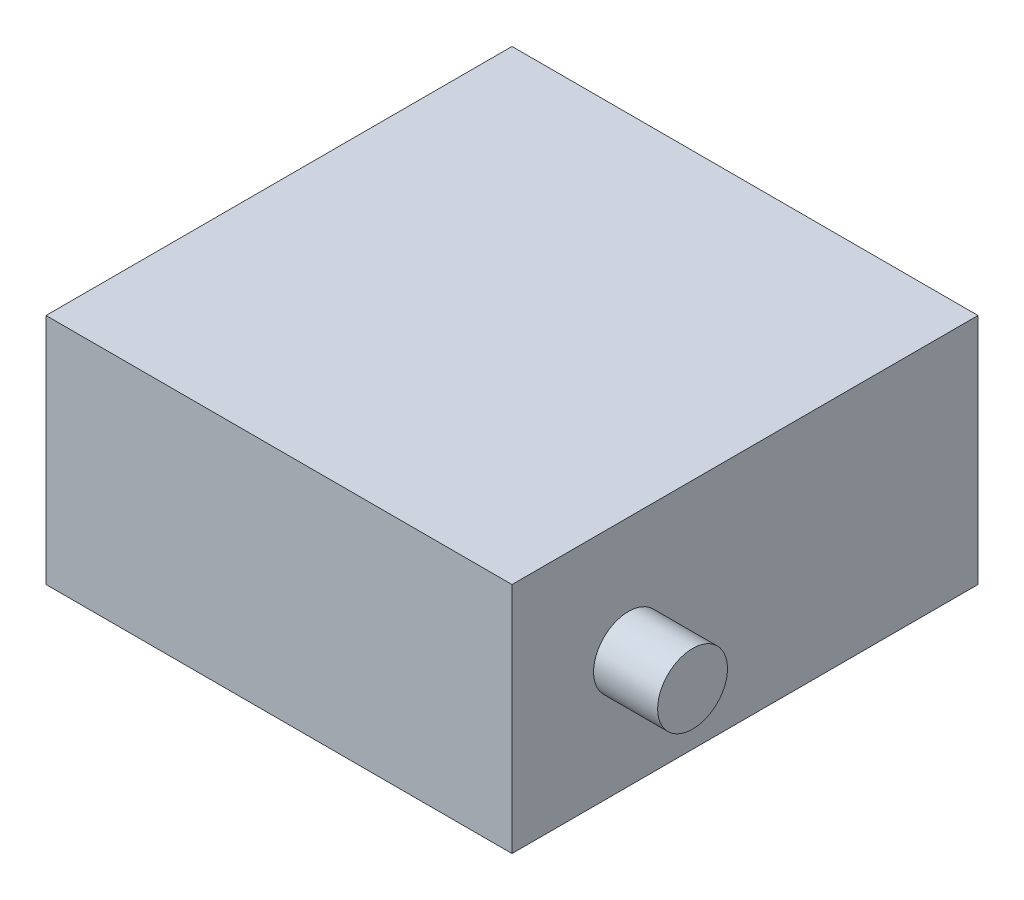
ISO-10303-21;
HEADER;
FILE_DESCRIPTION(('STEP AP214'),'2;1');
FILE_NAME('part.step','',(''),(''),'','','');
FILE_SCHEMA(('AUTOMOTIVE_DESIGN { 1 0 10303 214 1 1 1 1 }'));
ENDSEC;
DATA;
#1=APPLICATION_CONTEXT('core data for automotive mechanical design processes');
#2=APPLICATION_PROTOCOL_DEFINITION('international standard','automotive_design',2000,#1);
#3=PRODUCT_CONTEXT('',#1,'mechanical');
#4=PRODUCT('Part','Part','',(#3));
#5=PRODUCT_RELATED_PRODUCT_CATEGORY('part','',(#4));
#6=PRODUCT_DEFINITION_FORMATION('','',#4);
#7=PRODUCT_DEFINITION_CONTEXT('part definition',#1,'design');
#8=PRODUCT_DEFINITION('design','',#6,#7);
#9=PRODUCT_DEFINITION_SHAPE('','',#8);
#10=(LENGTH_UNIT() NAMED_UNIT(*) SI_UNIT(.MILLI.,.METRE.));
#11=(NAMED_UNIT(*) PLANE_ANGLE_UNIT() SI_UNIT($,.RADIAN.));
#12=(NAMED_UNIT(*) SI_UNIT($,.STERADIAN.) SOLID_ANGLE_UNIT());
#13=UNCERTAINTY_MEASURE_WITH_UNIT(LENGTH_MEASURE(1.E-05),#10,'distance_accuracy_value','');
#14=(GEOMETRIC_REPRESENTATION_CONTEXT(3) GLOBAL_UNCERTAINTY_ASSIGNED_CONTEXT((#13)) GLOBAL_UNIT_ASSIGNED_CONTEXT((#10,
#11,#12)) REPRESENTATION_CONTEXT('',''));
#15=CARTESIAN_POINT('',(0.,0.,0.));
#16=DIRECTION('',(0.,0.,1.));
#17=DIRECTION('',(1.,0.,0.));
#18=AXIS2_PLACEMENT_3D('',#15,#16,#17);
#19=CARTESIAN_POINT('',(20.,-10.,40.));
#20=DIRECTION('',(-1.,0.,0.));
#21=DIRECTION('',(0.,0.,1.));
#22=AXIS2_PLACEMENT_3D('',#19,#20,#21);
#23=PLANE('',#22);
#24=CARTESIAN_POINT('',(20.,0.,30.));
#25=DIRECTION('',(-1.,0.,0.));
#26=DIRECTION('',(0.,0.,1.));
#27=AXIS2_PLACEMENT_3D('',#24,#25,#26);
#28=CIRCLE('',#27,3.);
#29=CARTESIAN_POINT('',(20.,0.,33.));
#30=VERTEX_POINT('',#29);
#31=EDGE_CURVE('E131',#30,#30,#28,.T.);
#32=ORIENTED_EDGE('',*,*,#31,.T.);
#33=EDGE_LOOP('',(#32));
#34=FACE_BOUND('',#33,.T.);
#35=DIRECTION('',(0.,1.,0.));
#36=VECTOR('',#35,1.);
#37=CARTESIAN_POINT('',(20.,-10.,0.));
#38=LINE('',#37,#36);
#39=CARTESIAN_POINT('',(20.,-10.,0.));
#40=VERTEX_POINT('',#39);
#41=CARTESIAN_POINT('',(20.,10.,0.));
#42=VERTEX_POINT('',#41);
#43=EDGE_CURVE('E99',#40,#42,#38,.T.);
#44=ORIENTED_EDGE('',*,*,#43,.T.);
#45=DIRECTION('',(0.,0.,-1.));
#46=VECTOR('',#45,1.);
#47=CARTESIAN_POINT('',(20.,10.,40.));
#48=LINE('',#47,#46);
#49=CARTESIAN_POINT('',(20.,10.,40.));
#50=VERTEX_POINT('',#49);
#51=EDGE_CURVE('E41',#50,#42,#48,.T.);
#52=ORIENTED_EDGE('',*,*,#51,.F.);
#53=DIRECTION('',(0.,1.,0.));
#54=VECTOR('',#53,1.);
#55=CARTESIAN_POINT('',(20.,-10.,40.));
#56=LINE('',#55,#54);
#57=CARTESIAN_POINT('',(20.,-10.,40.));
#58=VERTEX_POINT('',#57);
#59=EDGE_CURVE('E85',#58,#50,#56,.T.);
#60=ORIENTED_EDGE('',*,*,#59,.F.);
#61=DIRECTION('',(0.,0.,-1.));
#62=VECTOR('',#61,1.);
#63=CARTESIAN_POINT('',(20.,-10.,40.));
#64=LINE('',#63,#62);
#65=EDGE_CURVE('E95',#58,#40,#64,.T.);
#66=ORIENTED_EDGE('',*,*,#65,.T.);
#67=EDGE_LOOP('',(#44,#52,#60,#66));
#68=FACE_BOUND('',#67,.T.);
#69=ADVANCED_FACE('F33',(#34,#68),#23,.F.);
#70=CARTESIAN_POINT('',(-20.,10.,40.));
#71=DIRECTION('',(0.,-1.,0.));
#72=DIRECTION('',(0.,0.,-1.));
#73=AXIS2_PLACEMENT_3D('',#70,#71,#72);
#74=PLANE('',#73);
#75=DIRECTION('',(-1.,0.,0.));
#76=VECTOR('',#75,1.);
#77=CARTESIAN_POINT('',(-20.,10.,0.));
#78=LINE('',#77,#76);
#79=CARTESIAN_POINT('',(-20.,10.,0.));
#80=VERTEX_POINT('',#79);
#81=EDGE_CURVE('E90',#42,#80,#78,.T.);
#82=ORIENTED_EDGE('',*,*,#81,.T.);
#83=DIRECTION('',(0.,0.,-1.));
#84=VECTOR('',#83,1.);
#85=CARTESIAN_POINT('',(-20.,10.,40.));
#86=LINE('',#85,#84);
#87=CARTESIAN_POINT('',(-20.,10.,40.));
#88=VERTEX_POINT('',#87);
#89=EDGE_CURVE('E88',#88,#80,#86,.T.);
#90=ORIENTED_EDGE('',*,*,#89,.F.);
#91=DIRECTION('',(-1.,0.,0.));
#92=VECTOR('',#91,1.);
#93=CARTESIAN_POINT('',(-20.,10.,40.));
#94=LINE('',#93,#92);
#95=EDGE_CURVE('E80',#50,#88,#94,.T.);
#96=ORIENTED_EDGE('',*,*,#95,.F.);
#97=ORIENTED_EDGE('',*,*,#51,.T.);
#98=EDGE_LOOP('',(#82,#90,#96,#97));
#99=FACE_BOUND('',#98,.T.);
#100=ADVANCED_FACE('F89',(#99),#74,.F.);
#101=CARTESIAN_POINT('',(-20.,-10.,40.));
#102=DIRECTION('',(1.,0.,0.));
#103=DIRECTION('',(0.,0.,-1.));
#104=AXIS2_PLACEMENT_3D('',#101,#102,#103);
#105=PLANE('',#104);
#106=CARTESIAN_POINT('',(-20.,0.,30.));
#107=DIRECTION('',(1.,0.,0.));
#108=DIRECTION('',(0.,0.,-1.));
#109=AXIS2_PLACEMENT_3D('',#106,#107,#108);
#110=CIRCLE('',#109,3.);
#111=CARTESIAN_POINT('',(-20.,0.,27.));
#112=VERTEX_POINT('',#111);
#113=EDGE_CURVE('E11',#112,#112,#110,.F.);
#114=ORIENTED_EDGE('',*,*,#113,.F.);
#115=EDGE_LOOP('',(#114));
#116=FACE_BOUND('',#115,.T.);
#117=DIRECTION('',(0.,-1.,0.));
#118=VECTOR('',#117,1.);
#119=CARTESIAN_POINT('',(-20.,-10.,0.));
#120=LINE('',#119,#118);
#121=CARTESIAN_POINT('',(-20.,-10.,0.));
#122=VERTEX_POINT('',#121);
#123=EDGE_CURVE('E66',#80,#122,#120,.T.);
#124=ORIENTED_EDGE('',*,*,#123,.T.);
#125=DIRECTION('',(0.,0.,-1.));
#126=VECTOR('',#125,1.);
#127=CARTESIAN_POINT('',(-20.,-10.,40.));
#128=LINE('',#127,#126);
#129=CARTESIAN_POINT('',(-20.,-10.,40.));
#130=VERTEX_POINT('',#129);
#131=EDGE_CURVE('E91',#130,#122,#128,.T.);
#132=ORIENTED_EDGE('',*,*,#131,.F.);
#133=DIRECTION('',(0.,-1.,0.));
#134=VECTOR('',#133,1.);
#135=CARTESIAN_POINT('',(-20.,-10.,40.));
#136=LINE('',#135,#134);
#137=EDGE_CURVE('E83',#88,#130,#136,.T.);
#138=ORIENTED_EDGE('',*,*,#137,.F.);
#139=ORIENTED_EDGE('',*,*,#89,.T.);
#140=EDGE_LOOP('',(#124,#132,#138,#139));
#141=FACE_BOUND('',#140,.T.);
#142=ADVANCED_FACE('F93',(#116,#141),#105,.F.);
#143=CARTESIAN_POINT('',(-20.,-10.,40.));
#144=DIRECTION('',(0.,1.,0.));
#145=DIRECTION('',(0.,0.,1.));
#146=AXIS2_PLACEMENT_3D('',#143,#144,#145);
#147=PLANE('',#146);
#148=DIRECTION('',(1.,0.,0.));
#149=VECTOR('',#148,1.);
#150=CARTESIAN_POINT('',(-20.,-10.,0.));
#151=LINE('',#150,#149);
#152=EDGE_CURVE('E72',#122,#40,#151,.T.);
#153=ORIENTED_EDGE('',*,*,#152,.T.);
#154=ORIENTED_EDGE('',*,*,#65,.F.);
#155=DIRECTION('',(1.,0.,0.));
#156=VECTOR('',#155,1.);
#157=CARTESIAN_POINT('',(-20.,-10.,40.));
#158=LINE('',#157,#156);
#159=EDGE_CURVE('E49',#130,#58,#158,.T.);
#160=ORIENTED_EDGE('',*,*,#159,.F.);
#161=ORIENTED_EDGE('',*,*,#131,.T.);
#162=EDGE_LOOP('',(#153,#154,#160,#161));
#163=FACE_BOUND('',#162,.T.);
#164=ADVANCED_FACE('F121',(#163),#147,.F.);
#165=CARTESIAN_POINT('',(0.,0.,40.));
#166=DIRECTION('',(0.,0.,-1.));
#167=DIRECTION('',(-1.,0.,0.));
#168=AXIS2_PLACEMENT_3D('',#165,#166,#167);
#169=PLANE('',#168);
#170=ORIENTED_EDGE('',*,*,#59,.T.);
#171=ORIENTED_EDGE('',*,*,#95,.T.);
#172=ORIENTED_EDGE('',*,*,#137,.T.);
#173=ORIENTED_EDGE('',*,*,#159,.T.);
#174=EDGE_LOOP('',(#170,#171,#172,#173));
#175=FACE_BOUND('',#174,.T.);
#176=ADVANCED_FACE('F81',(#175),#169,.F.);
#177=CARTESIAN_POINT('',(0.,0.,0.));
#178=DIRECTION('',(0.,0.,-1.));
#179=DIRECTION('',(-1.,0.,0.));
#180=AXIS2_PLACEMENT_3D('',#177,#178,#179);
#181=PLANE('',#180);
#182=ORIENTED_EDGE('',*,*,#43,.F.);
#183=ORIENTED_EDGE('',*,*,#152,.F.);
#184=ORIENTED_EDGE('',*,*,#123,.F.);
#185=ORIENTED_EDGE('',*,*,#81,.F.);
#186=EDGE_LOOP('',(#182,#183,#184,#185));
#187=FACE_BOUND('',#186,.T.);
#188=ADVANCED_FACE('F110',(#187),#181,.T.);
#189=CARTESIAN_POINT('',(-25.5,0.,30.));
#190=DIRECTION('',(1.,0.,0.));
#191=DIRECTION('',(0.,0.,-1.));
#192=AXIS2_PLACEMENT_3D('',#189,#190,#191);
#193=CYLINDRICAL_SURFACE('',#192,3.);
#194=CARTESIAN_POINT('',(-25.5,0.,30.));
#195=DIRECTION('',(-1.,0.,0.));
#196=DIRECTION('',(0.,0.,1.));
#197=AXIS2_PLACEMENT_3D('',#194,#195,#196);
#198=CIRCLE('',#197,3.);
#199=CARTESIAN_POINT('',(-25.5,0.,33.));
#200=VERTEX_POINT('',#199);
#201=EDGE_CURVE('E102',#200,#200,#198,.T.);
#202=ORIENTED_EDGE('',*,*,#201,.F.);
#203=EDGE_LOOP('',(#202));
#204=FACE_BOUND('',#203,.T.);
#205=ORIENTED_EDGE('',*,*,#113,.T.);
#206=EDGE_LOOP('',(#205));
#207=FACE_BOUND('',#206,.T.);
#208=ADVANCED_FACE('F112',(#204,#207),#193,.T.);
#209=CARTESIAN_POINT('',(-25.5,0.,30.));
#210=DIRECTION('',(-1.,0.,0.));
#211=DIRECTION('',(0.,0.,1.));
#212=AXIS2_PLACEMENT_3D('',#209,#210,#211);
#213=PLANE('',#212);
#214=ORIENTED_EDGE('',*,*,#201,.T.);
#215=EDGE_LOOP('',(#214));
#216=FACE_BOUND('',#215,.T.);
#217=ADVANCED_FACE('F118',(#216),#213,.T.);
#218=CARTESIAN_POINT('',(25.5,0.,30.));
#219=DIRECTION('',(-1.,0.,0.));
#220=DIRECTION('',(0.,0.,1.));
#221=AXIS2_PLACEMENT_3D('',#218,#219,#220);
#222=CYLINDRICAL_SURFACE('',#221,3.);
#223=CARTESIAN_POINT('',(25.5,0.,30.));
#224=DIRECTION('',(-1.,0.,0.));
#225=DIRECTION('',(0.,0.,1.));
#226=AXIS2_PLACEMENT_3D('',#223,#224,#225);
#227=CIRCLE('',#226,3.);
#228=CARTESIAN_POINT('',(25.5,0.,33.));
#229=VERTEX_POINT('',#228);
#230=EDGE_CURVE('E133',#229,#229,#227,.T.);
#231=ORIENTED_EDGE('',*,*,#230,.T.);
#232=EDGE_LOOP('',(#231));
#233=FACE_BOUND('',#232,.T.);
#234=ORIENTED_EDGE('',*,*,#31,.F.);
#235=EDGE_LOOP('',(#234));
#236=FACE_BOUND('',#235,.T.);
#237=ADVANCED_FACE('F179',(#233,#236),#222,.T.);
#238=CARTESIAN_POINT('',(25.5,0.,30.));
#239=DIRECTION('',(1.,0.,0.));
#240=DIRECTION('',(0.,0.,1.));
#241=AXIS2_PLACEMENT_3D('',#238,#239,#240);
#242=PLANE('',#241);
#243=ORIENTED_EDGE('',*,*,#230,.F.);
#244=EDGE_LOOP('',(#243));
#245=FACE_BOUND('',#244,.T.);
#246=ADVANCED_FACE('F193',(#245),#242,.T.);
#247=CLOSED_SHELL('',(#69,#100,#142,#164,#176,#188,#208,#217,#237,#246));
#248=MANIFOLD_SOLID_BREP('B2',#247);
#249=ADVANCED_BREP_SHAPE_REPRESENTATION('',(#18,#248),#14);
#250=SHAPE_DEFINITION_REPRESENTATION(#9,#249);
ENDSEC;
END-ISO-10303-21;
